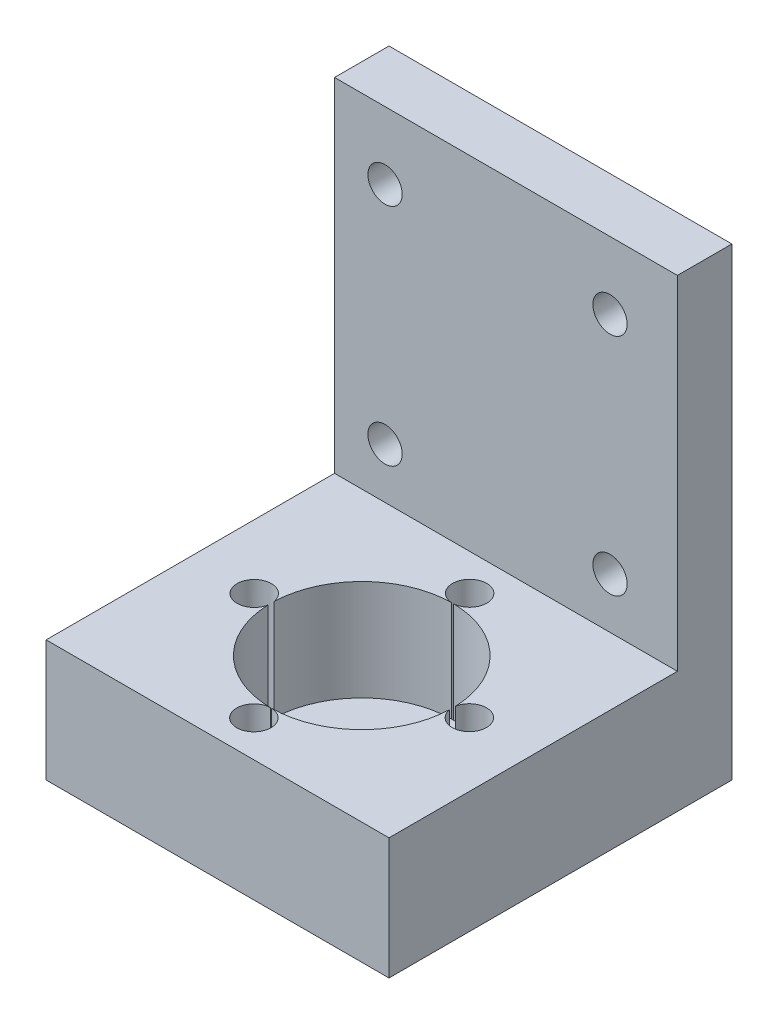
ISO-10303-21;
HEADER;
FILE_DESCRIPTION(('STEP AP214'),'2;1');
FILE_NAME('part.step','',(''),(''),'','','');
FILE_SCHEMA(('AUTOMOTIVE_DESIGN { 1 0 10303 214 1 1 1 1 }'));
ENDSEC;
DATA;
#1=APPLICATION_CONTEXT('core data for automotive mechanical design processes');
#2=APPLICATION_PROTOCOL_DEFINITION('international standard','automotive_design',2000,#1);
#3=PRODUCT_CONTEXT('',#1,'mechanical');
#4=PRODUCT('Part','Part','',(#3));
#5=PRODUCT_RELATED_PRODUCT_CATEGORY('part','',(#4));
#6=PRODUCT_DEFINITION_FORMATION('','',#4);
#7=PRODUCT_DEFINITION_CONTEXT('part definition',#1,'design');
#8=PRODUCT_DEFINITION('design','',#6,#7);
#9=PRODUCT_DEFINITION_SHAPE('','',#8);
#10=(LENGTH_UNIT() NAMED_UNIT(*) SI_UNIT(.MILLI.,.METRE.));
#11=(NAMED_UNIT(*) PLANE_ANGLE_UNIT() SI_UNIT($,.RADIAN.));
#12=(NAMED_UNIT(*) SI_UNIT($,.STERADIAN.) SOLID_ANGLE_UNIT());
#13=UNCERTAINTY_MEASURE_WITH_UNIT(LENGTH_MEASURE(1.E-05),#10,'distance_accuracy_value','');
#14=(GEOMETRIC_REPRESENTATION_CONTEXT(3) GLOBAL_UNCERTAINTY_ASSIGNED_CONTEXT((#13)) GLOBAL_UNIT_ASSIGNED_CONTEXT((#10,
#11,#12)) REPRESENTATION_CONTEXT('',''));
#15=CARTESIAN_POINT('',(0.,0.,0.));
#16=DIRECTION('',(0.,0.,1.));
#17=DIRECTION('',(1.,0.,0.));
#18=AXIS2_PLACEMENT_3D('',#15,#16,#17);
#19=CARTESIAN_POINT('',(0.,12.04,0.));
#20=DIRECTION('',(0.,-1.,0.));
#21=DIRECTION('',(0.,0.,-1.));
#22=AXIS2_PLACEMENT_3D('',#19,#20,#21);
#23=PLANE('',#22);
#24=DIRECTION('',(1.,0.,0.));
#25=VECTOR('',#24,1.);
#26=CARTESIAN_POINT('',(0.,12.04,-28.6));
#27=LINE('',#26,#25);
#28=CARTESIAN_POINT('',(0.,12.04,-28.6));
#29=VERTEX_POINT('',#28);
#30=CARTESIAN_POINT('',(34.,12.04,-28.6));
#31=VERTEX_POINT('',#30);
#32=EDGE_CURVE('E1816',#29,#31,#27,.T.);
#33=ORIENTED_EDGE('',*,*,#32,.F.);
#34=DIRECTION('',(0.,0.,1.));
#35=VECTOR('',#34,1.);
#36=CARTESIAN_POINT('',(0.,12.04,0.));
#37=LINE('',#36,#35);
#38=CARTESIAN_POINT('',(0.,12.04,0.));
#39=VERTEX_POINT('',#38);
#40=EDGE_CURVE('E1863',#29,#39,#37,.T.);
#41=ORIENTED_EDGE('',*,*,#40,.T.);
#42=DIRECTION('',(1.,0.,0.));
#43=VECTOR('',#42,1.);
#44=CARTESIAN_POINT('',(0.,12.04,0.));
#45=LINE('',#44,#43);
#46=CARTESIAN_POINT('',(34.,12.04,0.));
#47=VERTEX_POINT('',#46);
#48=EDGE_CURVE('E1879',#39,#47,#45,.T.);
#49=ORIENTED_EDGE('',*,*,#48,.T.);
#50=DIRECTION('',(0.,0.,-1.));
#51=VECTOR('',#50,1.);
#52=CARTESIAN_POINT('',(34.,12.04,0.));
#53=LINE('',#52,#51);
#54=EDGE_CURVE('E1857',#47,#31,#53,.T.);
#55=ORIENTED_EDGE('',*,*,#54,.T.);
#56=EDGE_LOOP('',(#33,#41,#49,#55));
#57=FACE_BOUND('',#56,.T.);
#58=CARTESIAN_POINT('',(17.,12.04,-3.60086466627301));
#59=DIRECTION('',(0.,1.,0.));
#60=DIRECTION('',(0.,0.,1.));
#61=AXIS2_PLACEMENT_3D('',#58,#59,#60);
#62=CIRCLE('',#61,1.7);
#63=CARTESIAN_POINT('',(16.9502774097286,12.04,-5.30013735304717));
#64=VERTEX_POINT('',#63);
#65=CARTESIAN_POINT('',(17.0497225902714,12.04,-5.30013735304717));
#66=VERTEX_POINT('',#65);
#67=EDGE_CURVE('E1739',#64,#66,#62,.T.);
#68=ORIENTED_EDGE('',*,*,#67,.F.);
#69=CARTESIAN_POINT('',(17.,12.04,-14.3));
#70=DIRECTION('',(0.,1.,0.));
#71=DIRECTION('',(0.,0.,1.));
#72=AXIS2_PLACEMENT_3D('',#69,#70,#71);
#73=CIRCLE('',#72,9.);
#74=CARTESIAN_POINT('',(8.0053002863898,12.04,-13.9911682302926));
#75=VERTEX_POINT('',#74);
#76=EDGE_CURVE('E1733',#75,#64,#73,.T.);
#77=ORIENTED_EDGE('',*,*,#76,.F.);
#78=CARTESIAN_POINT('',(6.33358771001208,12.04,-14.3));
#79=DIRECTION('',(0.,1.,0.));
#80=DIRECTION('',(0.,0.,1.));
#81=AXIS2_PLACEMENT_3D('',#78,#79,#80);
#82=CIRCLE('',#81,1.7);
#83=CARTESIAN_POINT('',(8.0053002863898,12.04,-14.6088317697074));
#84=VERTEX_POINT('',#83);
#85=EDGE_CURVE('E1994',#84,#75,#82,.T.);
#86=ORIENTED_EDGE('',*,*,#85,.F.);
#87=CARTESIAN_POINT('',(16.9142641182388,12.04,-23.299591621767));
#88=VERTEX_POINT('',#87);
#89=EDGE_CURVE('E1718',#88,#84,#73,.T.);
#90=ORIENTED_EDGE('',*,*,#89,.F.);
#91=CARTESIAN_POINT('',(17.,12.04,-24.9974282919384));
#92=DIRECTION('',(0.,1.,0.));
#93=DIRECTION('',(0.,0.,1.));
#94=AXIS2_PLACEMENT_3D('',#91,#92,#93);
#95=CIRCLE('',#94,1.7);
#96=CARTESIAN_POINT('',(17.0857358817612,12.04,-23.299591621767));
#97=VERTEX_POINT('',#96);
#98=EDGE_CURVE('E1698',#97,#88,#95,.T.);
#99=ORIENTED_EDGE('',*,*,#98,.F.);
#100=CARTESIAN_POINT('',(25.9950848581649,12.04,-14.5974027478235));
#101=VERTEX_POINT('',#100);
#102=EDGE_CURVE('E1715',#101,#97,#73,.T.);
#103=ORIENTED_EDGE('',*,*,#102,.F.);
#104=CARTESIAN_POINT('',(27.6688685073224,12.04,-14.3));
#105=DIRECTION('',(0.,1.,0.));
#106=DIRECTION('',(0.,0.,1.));
#107=AXIS2_PLACEMENT_3D('',#104,#105,#106);
#108=CIRCLE('',#107,1.700000029);
#109=CARTESIAN_POINT('',(25.9950848581649,12.04,-14.0025972521765));
#110=VERTEX_POINT('',#109);
#111=EDGE_CURVE('E1981',#110,#101,#108,.T.);
#112=ORIENTED_EDGE('',*,*,#111,.F.);
#113=EDGE_CURVE('E1600',#66,#110,#73,.T.);
#114=ORIENTED_EDGE('',*,*,#113,.F.);
#115=EDGE_LOOP('',(#68,#77,#86,#90,#99,#103,#112,#114));
#116=FACE_BOUND('',#115,.T.);
#117=ADVANCED_FACE('F1592',(#57,#116),#23,.F.);
#118=CARTESIAN_POINT('',(17.,2.04,-14.3));
#119=DIRECTION('',(0.,1.,0.));
#120=DIRECTION('',(0.,0.,1.));
#121=AXIS2_PLACEMENT_3D('',#118,#119,#120);
#122=CYLINDRICAL_SURFACE('',#121,9.);
#123=CARTESIAN_POINT('',(17.,2.04,-14.3));
#124=DIRECTION('',(0.,1.,0.));
#125=DIRECTION('',(0.,0.,1.));
#126=AXIS2_PLACEMENT_3D('',#123,#124,#125);
#127=CIRCLE('',#126,9.);
#128=CARTESIAN_POINT('',(17.0497225902711,2.04,-5.30013735304717));
#129=VERTEX_POINT('',#128);
#130=CARTESIAN_POINT('',(25.9950848581649,2.04,-14.0025972521765));
#131=VERTEX_POINT('',#130);
#132=EDGE_CURVE('E1811',#129,#131,#127,.T.);
#133=ORIENTED_EDGE('',*,*,#132,.F.);
#134=DIRECTION('',(0.,1.,0.));
#135=VECTOR('',#134,1.);
#136=CARTESIAN_POINT('',(17.0497225902711,6.02,-5.30013735304718));
#137=LINE('',#136,#135);
#138=EDGE_CURVE('E1748',#129,#66,#137,.T.);
#139=ORIENTED_EDGE('',*,*,#138,.T.);
#140=ORIENTED_EDGE('',*,*,#113,.T.);
#141=DIRECTION('',(0.,1.,0.));
#142=VECTOR('',#141,1.);
#143=CARTESIAN_POINT('',(25.9950848581649,6.02,-14.0025972521765));
#144=LINE('',#143,#142);
#145=EDGE_CURVE('E1975',#110,#131,#144,.F.);
#146=ORIENTED_EDGE('',*,*,#145,.T.);
#147=EDGE_LOOP('',(#133,#139,#140,#146));
#148=FACE_BOUND('',#147,.T.);
#149=ADVANCED_FACE('F1931',(#148),#122,.F.);
#150=CARTESIAN_POINT('',(25.9950848581649,2.04,-14.5974027478235));
#151=VERTEX_POINT('',#150);
#152=CARTESIAN_POINT('',(17.0857358817611,2.04,-23.299591621767));
#153=VERTEX_POINT('',#152);
#154=EDGE_CURVE('E1818',#151,#153,#127,.T.);
#155=ORIENTED_EDGE('',*,*,#154,.F.);
#156=DIRECTION('',(0.,1.,0.));
#157=VECTOR('',#156,1.);
#158=CARTESIAN_POINT('',(25.9950848581649,6.02,-14.5974027478235));
#159=LINE('',#158,#157);
#160=EDGE_CURVE('E1721',#151,#101,#159,.T.);
#161=ORIENTED_EDGE('',*,*,#160,.T.);
#162=ORIENTED_EDGE('',*,*,#102,.T.);
#163=DIRECTION('',(0.,1.,0.));
#164=VECTOR('',#163,1.);
#165=CARTESIAN_POINT('',(17.0857358817611,6.02,-23.299591621767));
#166=LINE('',#165,#164);
#167=EDGE_CURVE('E1694',#97,#153,#166,.F.);
#168=ORIENTED_EDGE('',*,*,#167,.T.);
#169=EDGE_LOOP('',(#155,#161,#162,#168));
#170=FACE_BOUND('',#169,.T.);
#171=ADVANCED_FACE('F1725',(#170),#122,.F.);
#172=ORIENTED_EDGE('',*,*,#76,.T.);
#173=DIRECTION('',(0.,1.,0.));
#174=VECTOR('',#173,1.);
#175=CARTESIAN_POINT('',(16.9502774097289,6.02,-5.30013735304718));
#176=LINE('',#175,#174);
#177=CARTESIAN_POINT('',(16.9502774097289,2.04,-5.30013735304717));
#178=VERTEX_POINT('',#177);
#179=EDGE_CURVE('E1756',#64,#178,#176,.F.);
#180=ORIENTED_EDGE('',*,*,#179,.T.);
#181=CARTESIAN_POINT('',(8.0053002863898,2.04,-13.9911682302927));
#182=VERTEX_POINT('',#181);
#183=EDGE_CURVE('E1728',#182,#178,#127,.T.);
#184=ORIENTED_EDGE('',*,*,#183,.F.);
#185=DIRECTION('',(0.,1.,0.));
#186=VECTOR('',#185,1.);
#187=CARTESIAN_POINT('',(8.0053002863898,6.02,-13.9911682302927));
#188=LINE('',#187,#186);
#189=EDGE_CURVE('E1612',#182,#75,#188,.T.);
#190=ORIENTED_EDGE('',*,*,#189,.T.);
#191=EDGE_LOOP('',(#172,#180,#184,#190));
#192=FACE_BOUND('',#191,.T.);
#193=ADVANCED_FACE('F1952',(#192),#122,.F.);
#194=CARTESIAN_POINT('',(0.,12.04,0.));
#195=DIRECTION('',(1.,0.,0.));
#196=DIRECTION('',(0.,0.,-1.));
#197=AXIS2_PLACEMENT_3D('',#194,#195,#196);
#198=PLANE('',#197);
#199=DIRECTION('',(0.,0.,1.));
#200=VECTOR('',#199,1.);
#201=CARTESIAN_POINT('',(0.,0.,0.));
#202=LINE('',#201,#200);
#203=CARTESIAN_POINT('',(0.,0.,-34.));
#204=VERTEX_POINT('',#203);
#205=CARTESIAN_POINT('',(0.,0.,0.));
#206=VERTEX_POINT('',#205);
#207=EDGE_CURVE('E1869',#204,#206,#202,.T.);
#208=ORIENTED_EDGE('',*,*,#207,.T.);
#209=DIRECTION('',(0.,-1.,0.));
#210=VECTOR('',#209,1.);
#211=CARTESIAN_POINT('',(0.,12.04,0.));
#212=LINE('',#211,#210);
#213=EDGE_CURVE('E1842',#39,#206,#212,.T.);
#214=ORIENTED_EDGE('',*,*,#213,.F.);
#215=ORIENTED_EDGE('',*,*,#40,.F.);
#216=DIRECTION('',(0.,-1.,0.));
#217=VECTOR('',#216,1.);
#218=CARTESIAN_POINT('',(0.,46.04,-28.6));
#219=LINE('',#218,#217);
#220=CARTESIAN_POINT('',(0.,46.04,-28.6));
#221=VERTEX_POINT('',#220);
#222=EDGE_CURVE('E1871',#221,#29,#219,.T.);
#223=ORIENTED_EDGE('',*,*,#222,.F.);
#224=DIRECTION('',(0.,0.,1.));
#225=VECTOR('',#224,1.);
#226=CARTESIAN_POINT('',(0.,46.04,-34.));
#227=LINE('',#226,#225);
#228=CARTESIAN_POINT('',(0.,46.04,-34.));
#229=VERTEX_POINT('',#228);
#230=EDGE_CURVE('E1895',#229,#221,#227,.T.);
#231=ORIENTED_EDGE('',*,*,#230,.F.);
#232=DIRECTION('',(0.,-1.,0.));
#233=VECTOR('',#232,1.);
#234=CARTESIAN_POINT('',(0.,12.04,-34.));
#235=LINE('',#234,#233);
#236=EDGE_CURVE('E1852',#229,#204,#235,.T.);
#237=ORIENTED_EDGE('',*,*,#236,.T.);
#238=EDGE_LOOP('',(#208,#214,#215,#223,#231,#237));
#239=FACE_BOUND('',#238,.T.);
#240=ADVANCED_FACE('F1594',(#239),#198,.F.);
#241=CARTESIAN_POINT('',(0.,12.04,0.));
#242=DIRECTION('',(0.,0.,-1.));
#243=DIRECTION('',(-1.,0.,0.));
#244=AXIS2_PLACEMENT_3D('',#241,#242,#243);
#245=PLANE('',#244);
#246=DIRECTION('',(1.,0.,0.));
#247=VECTOR('',#246,1.);
#248=CARTESIAN_POINT('',(0.,0.,0.));
#249=LINE('',#248,#247);
#250=CARTESIAN_POINT('',(34.,0.,0.));
#251=VERTEX_POINT('',#250);
#252=EDGE_CURVE('E1870',#206,#251,#249,.T.);
#253=ORIENTED_EDGE('',*,*,#252,.T.);
#254=DIRECTION('',(0.,-1.,0.));
#255=VECTOR('',#254,1.);
#256=CARTESIAN_POINT('',(34.,12.04,0.));
#257=LINE('',#256,#255);
#258=EDGE_CURVE('E1847',#47,#251,#257,.T.);
#259=ORIENTED_EDGE('',*,*,#258,.F.);
#260=ORIENTED_EDGE('',*,*,#48,.F.);
#261=ORIENTED_EDGE('',*,*,#213,.T.);
#262=EDGE_LOOP('',(#253,#259,#260,#261));
#263=FACE_BOUND('',#262,.T.);
#264=ADVANCED_FACE('F1932',(#263),#245,.F.);
#265=CARTESIAN_POINT('',(34.,12.04,0.));
#266=DIRECTION('',(-1.,0.,0.));
#267=DIRECTION('',(0.,0.,1.));
#268=AXIS2_PLACEMENT_3D('',#265,#266,#267);
#269=PLANE('',#268);
#270=DIRECTION('',(0.,0.,-1.));
#271=VECTOR('',#270,1.);
#272=CARTESIAN_POINT('',(34.,0.,0.));
#273=LINE('',#272,#271);
#274=CARTESIAN_POINT('',(34.,0.,-34.));
#275=VERTEX_POINT('',#274);
#276=EDGE_CURVE('E1862',#251,#275,#273,.T.);
#277=ORIENTED_EDGE('',*,*,#276,.T.);
#278=DIRECTION('',(0.,-1.,0.));
#279=VECTOR('',#278,1.);
#280=CARTESIAN_POINT('',(34.,12.04,-34.));
#281=LINE('',#280,#279);
#282=CARTESIAN_POINT('',(34.,46.04,-34.));
#283=VERTEX_POINT('',#282);
#284=EDGE_CURVE('E1853',#283,#275,#281,.T.);
#285=ORIENTED_EDGE('',*,*,#284,.F.);
#286=DIRECTION('',(0.,0.,-1.));
#287=VECTOR('',#286,1.);
#288=CARTESIAN_POINT('',(34.,46.04,-34.));
#289=LINE('',#288,#287);
#290=CARTESIAN_POINT('',(34.,46.04,-28.6));
#291=VERTEX_POINT('',#290);
#292=EDGE_CURVE('E1899',#291,#283,#289,.T.);
#293=ORIENTED_EDGE('',*,*,#292,.F.);
#294=DIRECTION('',(0.,-1.,0.));
#295=VECTOR('',#294,1.);
#296=CARTESIAN_POINT('',(34.,46.04,-28.6));
#297=LINE('',#296,#295);
#298=EDGE_CURVE('E1881',#291,#31,#297,.T.);
#299=ORIENTED_EDGE('',*,*,#298,.T.);
#300=ORIENTED_EDGE('',*,*,#54,.F.);
#301=ORIENTED_EDGE('',*,*,#258,.T.);
#302=EDGE_LOOP('',(#277,#285,#293,#299,#300,#301));
#303=FACE_BOUND('',#302,.T.);
#304=ADVANCED_FACE('F1919',(#303),#269,.F.);
#305=CARTESIAN_POINT('',(0.,12.04,-34.));
#306=DIRECTION('',(0.,0.,1.));
#307=DIRECTION('',(1.,0.,0.));
#308=AXIS2_PLACEMENT_3D('',#305,#306,#307);
#309=PLANE('',#308);
#310=CARTESIAN_POINT('',(27.3170867062394,17.0466827237252,-34.));
#311=DIRECTION('',(0.,0.,1.));
#312=DIRECTION('',(1.,0.,0.));
#313=AXIS2_PLACEMENT_3D('',#310,#311,#312);
#314=CIRCLE('',#313,1.7);
#315=CARTESIAN_POINT('',(29.0170867062394,17.0466827237252,-34.));
#316=VERTEX_POINT('',#315);
#317=EDGE_CURVE('E2080',#316,#316,#314,.T.);
#318=ORIENTED_EDGE('',*,*,#317,.T.);
#319=EDGE_LOOP('',(#318));
#320=FACE_BOUND('',#319,.T.);
#321=CARTESIAN_POINT('',(27.3170867062394,39.3570867062394,-34.));
#322=DIRECTION('',(0.,0.,1.));
#323=DIRECTION('',(1.,0.,0.));
#324=AXIS2_PLACEMENT_3D('',#321,#322,#323);
#325=CIRCLE('',#324,1.7);
#326=CARTESIAN_POINT('',(29.0170867062394,39.3570867062394,-34.));
#327=VERTEX_POINT('',#326);
#328=EDGE_CURVE('E2070',#327,#327,#325,.T.);
#329=ORIENTED_EDGE('',*,*,#328,.T.);
#330=EDGE_LOOP('',(#329));
#331=FACE_BOUND('',#330,.T.);
#332=CARTESIAN_POINT('',(5.00668272372523,39.3570867062394,-34.));
#333=DIRECTION('',(0.,0.,1.));
#334=DIRECTION('',(1.,0.,0.));
#335=AXIS2_PLACEMENT_3D('',#332,#333,#334);
#336=CIRCLE('',#335,1.7);
#337=CARTESIAN_POINT('',(6.70668272372523,39.3570867062394,-34.));
#338=VERTEX_POINT('',#337);
#339=EDGE_CURVE('E2050',#338,#338,#336,.T.);
#340=ORIENTED_EDGE('',*,*,#339,.T.);
#341=EDGE_LOOP('',(#340));
#342=FACE_BOUND('',#341,.T.);
#343=CARTESIAN_POINT('',(5.00668272372523,17.0466827237252,-34.));
#344=DIRECTION('',(0.,0.,1.));
#345=DIRECTION('',(1.,0.,0.));
#346=AXIS2_PLACEMENT_3D('',#343,#344,#345);
#347=CIRCLE('',#346,1.7);
#348=CARTESIAN_POINT('',(6.70668272372523,17.0466827237252,-34.));
#349=VERTEX_POINT('',#348);
#350=EDGE_CURVE('E2063',#349,#349,#347,.T.);
#351=ORIENTED_EDGE('',*,*,#350,.T.);
#352=EDGE_LOOP('',(#351));
#353=FACE_BOUND('',#352,.T.);
#354=DIRECTION('',(-1.,0.,0.));
#355=VECTOR('',#354,1.);
#356=CARTESIAN_POINT('',(0.,0.,-34.));
#357=LINE('',#356,#355);
#358=EDGE_CURVE('E1859',#275,#204,#357,.T.);
#359=ORIENTED_EDGE('',*,*,#358,.T.);
#360=ORIENTED_EDGE('',*,*,#236,.F.);
#361=DIRECTION('',(-1.,0.,0.));
#362=VECTOR('',#361,1.);
#363=CARTESIAN_POINT('',(0.,46.04,-34.));
#364=LINE('',#363,#362);
#365=EDGE_CURVE('E1889',#283,#229,#364,.T.);
#366=ORIENTED_EDGE('',*,*,#365,.F.);
#367=ORIENTED_EDGE('',*,*,#284,.T.);
#368=EDGE_LOOP('',(#359,#360,#366,#367));
#369=FACE_BOUND('',#368,.T.);
#370=ADVANCED_FACE('F1925',(#320,#331,#342,#353,#369),#309,.F.);
#371=CARTESIAN_POINT('',(0.,0.,0.));
#372=DIRECTION('',(0.,-1.,0.));
#373=DIRECTION('',(0.,0.,-1.));
#374=AXIS2_PLACEMENT_3D('',#371,#372,#373);
#375=PLANE('',#374);
#376=CARTESIAN_POINT('',(17.,0.,-14.3));
#377=DIRECTION('',(0.,1.,0.));
#378=DIRECTION('',(0.,0.,1.));
#379=AXIS2_PLACEMENT_3D('',#376,#377,#378);
#380=CIRCLE('',#379,3.);
#381=CARTESIAN_POINT('',(17.,0.,-11.3));
#382=VERTEX_POINT('',#381);
#383=EDGE_CURVE('E2001',#382,#382,#380,.T.);
#384=ORIENTED_EDGE('',*,*,#383,.T.);
#385=EDGE_LOOP('',(#384));
#386=FACE_BOUND('',#385,.T.);
#387=CARTESIAN_POINT('',(17.,0.,-3.60086466627301));
#388=DIRECTION('',(0.,1.,0.));
#389=DIRECTION('',(0.,0.,1.));
#390=AXIS2_PLACEMENT_3D('',#387,#388,#389);
#391=CIRCLE('',#390,1.7);
#392=CARTESIAN_POINT('',(17.,0.,-1.90086466627301));
#393=VERTEX_POINT('',#392);
#394=EDGE_CURVE('E1707',#393,#393,#391,.T.);
#395=ORIENTED_EDGE('',*,*,#394,.T.);
#396=EDGE_LOOP('',(#395));
#397=FACE_BOUND('',#396,.T.);
#398=CARTESIAN_POINT('',(27.6688685073224,0.,-14.3));
#399=DIRECTION('',(0.,1.,0.));
#400=DIRECTION('',(0.,0.,1.));
#401=AXIS2_PLACEMENT_3D('',#398,#399,#400);
#402=CIRCLE('',#401,1.700000029);
#403=CARTESIAN_POINT('',(27.6688685073224,0.,-12.599999971));
#404=VERTEX_POINT('',#403);
#405=EDGE_CURVE('E1987',#404,#404,#402,.T.);
#406=ORIENTED_EDGE('',*,*,#405,.T.);
#407=EDGE_LOOP('',(#406));
#408=FACE_BOUND('',#407,.T.);
#409=CARTESIAN_POINT('',(6.33358771001208,0.,-14.3));
#410=DIRECTION('',(0.,1.,0.));
#411=DIRECTION('',(0.,0.,1.));
#412=AXIS2_PLACEMENT_3D('',#409,#410,#411);
#413=CIRCLE('',#412,1.7);
#414=CARTESIAN_POINT('',(6.33358771001208,0.,-12.6));
#415=VERTEX_POINT('',#414);
#416=EDGE_CURVE('E1717',#415,#415,#413,.T.);
#417=ORIENTED_EDGE('',*,*,#416,.T.);
#418=EDGE_LOOP('',(#417));
#419=FACE_BOUND('',#418,.T.);
#420=CARTESIAN_POINT('',(17.,0.,-24.9974282919384));
#421=DIRECTION('',(0.,1.,0.));
#422=DIRECTION('',(0.,0.,1.));
#423=AXIS2_PLACEMENT_3D('',#420,#421,#422);
#424=CIRCLE('',#423,1.7);
#425=CARTESIAN_POINT('',(17.,0.,-23.2974282919384));
#426=VERTEX_POINT('',#425);
#427=EDGE_CURVE('E1720',#426,#426,#424,.T.);
#428=ORIENTED_EDGE('',*,*,#427,.T.);
#429=EDGE_LOOP('',(#428));
#430=FACE_BOUND('',#429,.T.);
#431=ORIENTED_EDGE('',*,*,#207,.F.);
#432=ORIENTED_EDGE('',*,*,#358,.F.);
#433=ORIENTED_EDGE('',*,*,#276,.F.);
#434=ORIENTED_EDGE('',*,*,#252,.F.);
#435=EDGE_LOOP('',(#431,#432,#433,#434));
#436=FACE_BOUND('',#435,.T.);
#437=ADVANCED_FACE('F1927',(#386,#397,#408,#419,#430,#436),#375,.T.);
#438=CARTESIAN_POINT('',(0.,46.04,-28.6));
#439=DIRECTION('',(0.,0.,-1.));
#440=DIRECTION('',(-1.,0.,0.));
#441=AXIS2_PLACEMENT_3D('',#438,#439,#440);
#442=PLANE('',#441);
#443=CARTESIAN_POINT('',(27.3170867062394,17.0466827237252,-28.6));
#444=DIRECTION('',(0.,0.,1.));
#445=DIRECTION('',(1.,0.,0.));
#446=AXIS2_PLACEMENT_3D('',#443,#444,#445);
#447=CIRCLE('',#446,1.7);
#448=CARTESIAN_POINT('',(29.0170867062394,17.0466827237252,-28.6));
#449=VERTEX_POINT('',#448);
#450=EDGE_CURVE('E2071',#449,#449,#447,.T.);
#451=ORIENTED_EDGE('',*,*,#450,.F.);
#452=EDGE_LOOP('',(#451));
#453=FACE_BOUND('',#452,.T.);
#454=CARTESIAN_POINT('',(27.3170867062394,39.3570867062394,-28.6));
#455=DIRECTION('',(0.,0.,1.));
#456=DIRECTION('',(1.,0.,0.));
#457=AXIS2_PLACEMENT_3D('',#454,#455,#456);
#458=CIRCLE('',#457,1.7);
#459=CARTESIAN_POINT('',(29.0170867062394,39.3570867062394,-28.6));
#460=VERTEX_POINT('',#459);
#461=EDGE_CURVE('E2062',#460,#460,#458,.T.);
#462=ORIENTED_EDGE('',*,*,#461,.F.);
#463=EDGE_LOOP('',(#462));
#464=FACE_BOUND('',#463,.T.);
#465=CARTESIAN_POINT('',(5.00668272372523,39.3570867062394,-28.6));
#466=DIRECTION('',(0.,0.,1.));
#467=DIRECTION('',(1.,0.,0.));
#468=AXIS2_PLACEMENT_3D('',#465,#466,#467);
#469=CIRCLE('',#468,1.7);
#470=CARTESIAN_POINT('',(6.70668272372523,39.3570867062394,-28.6));
#471=VERTEX_POINT('',#470);
#472=EDGE_CURVE('E2055',#471,#471,#469,.T.);
#473=ORIENTED_EDGE('',*,*,#472,.F.);
#474=EDGE_LOOP('',(#473));
#475=FACE_BOUND('',#474,.T.);
#476=CARTESIAN_POINT('',(5.00668272372523,17.0466827237252,-28.6));
#477=DIRECTION('',(0.,0.,1.));
#478=DIRECTION('',(1.,0.,0.));
#479=AXIS2_PLACEMENT_3D('',#476,#477,#478);
#480=CIRCLE('',#479,1.7);
#481=CARTESIAN_POINT('',(6.70668272372523,17.0466827237252,-28.6));
#482=VERTEX_POINT('',#481);
#483=EDGE_CURVE('E2053',#482,#482,#480,.T.);
#484=ORIENTED_EDGE('',*,*,#483,.F.);
#485=EDGE_LOOP('',(#484));
#486=FACE_BOUND('',#485,.T.);
#487=ORIENTED_EDGE('',*,*,#32,.T.);
#488=ORIENTED_EDGE('',*,*,#298,.F.);
#489=DIRECTION('',(1.,0.,0.));
#490=VECTOR('',#489,1.);
#491=CARTESIAN_POINT('',(0.,46.04,-28.6));
#492=LINE('',#491,#490);
#493=EDGE_CURVE('E1903',#221,#291,#492,.T.);
#494=ORIENTED_EDGE('',*,*,#493,.F.);
#495=ORIENTED_EDGE('',*,*,#222,.T.);
#496=EDGE_LOOP('',(#487,#488,#494,#495));
#497=FACE_BOUND('',#496,.T.);
#498=ADVANCED_FACE('F1916',(#453,#464,#475,#486,#497),#442,.F.);
#499=CARTESIAN_POINT('',(0.,46.04,0.));
#500=DIRECTION('',(0.,1.,0.));
#501=DIRECTION('',(0.,0.,1.));
#502=AXIS2_PLACEMENT_3D('',#499,#500,#501);
#503=PLANE('',#502);
#504=ORIENTED_EDGE('',*,*,#230,.T.);
#505=ORIENTED_EDGE('',*,*,#493,.T.);
#506=ORIENTED_EDGE('',*,*,#292,.T.);
#507=ORIENTED_EDGE('',*,*,#365,.T.);
#508=EDGE_LOOP('',(#504,#505,#506,#507));
#509=FACE_BOUND('',#508,.T.);
#510=ADVANCED_FACE('F1909',(#509),#503,.T.);
#511=ORIENTED_EDGE('',*,*,#89,.T.);
#512=DIRECTION('',(0.,1.,0.));
#513=VECTOR('',#512,1.);
#514=CARTESIAN_POINT('',(8.0053002863898,6.02,-14.6088317697073));
#515=LINE('',#514,#513);
#516=CARTESIAN_POINT('',(8.0053002863898,2.04,-14.6088317697073));
#517=VERTEX_POINT('',#516);
#518=EDGE_CURVE('E1962',#84,#517,#515,.F.);
#519=ORIENTED_EDGE('',*,*,#518,.T.);
#520=CARTESIAN_POINT('',(16.9142641182389,2.04,-23.299591621767));
#521=VERTEX_POINT('',#520);
#522=EDGE_CURVE('E1825',#521,#517,#127,.T.);
#523=ORIENTED_EDGE('',*,*,#522,.F.);
#524=DIRECTION('',(0.,1.,0.));
#525=VECTOR('',#524,1.);
#526=CARTESIAN_POINT('',(16.9142641182389,6.02,-23.299591621767));
#527=LINE('',#526,#525);
#528=EDGE_CURVE('E1616',#521,#88,#527,.T.);
#529=ORIENTED_EDGE('',*,*,#528,.T.);
#530=EDGE_LOOP('',(#511,#519,#523,#529));
#531=FACE_BOUND('',#530,.T.);
#532=ADVANCED_FACE('F1798',(#531),#122,.F.);
#533=CARTESIAN_POINT('',(17.,2.04,-14.3));
#534=DIRECTION('',(0.,1.,0.));
#535=DIRECTION('',(0.,0.,1.));
#536=AXIS2_PLACEMENT_3D('',#533,#534,#535);
#537=PLANE('',#536);
#538=CARTESIAN_POINT('',(17.,2.04,-14.3));
#539=DIRECTION('',(0.,1.,0.));
#540=DIRECTION('',(0.,0.,1.));
#541=AXIS2_PLACEMENT_3D('',#538,#539,#540);
#542=CIRCLE('',#541,3.);
#543=CARTESIAN_POINT('',(17.,2.04,-11.3));
#544=VERTEX_POINT('',#543);
#545=EDGE_CURVE('E2083',#544,#544,#542,.T.);
#546=ORIENTED_EDGE('',*,*,#545,.F.);
#547=EDGE_LOOP('',(#546));
#548=FACE_BOUND('',#547,.T.);
#549=CARTESIAN_POINT('',(16.9502774097289,2.04,-5.30013735304718));
#550=CARTESIAN_POINT('',(17.,2.04,-5.30159229079938));
#551=CARTESIAN_POINT('',(17.0497225902711,2.04,-5.30013735304718));
#552=B_SPLINE_CURVE_WITH_KNOTS('',2,(#549,#550,#551),.UNSPECIFIED.,.F.,.F.,(3,3),(0.,1.),.UNSPECIFIED.);
#553=EDGE_CURVE('E12',#178,#129,#552,.T.);
#554=ORIENTED_EDGE('',*,*,#553,.T.);
#555=ORIENTED_EDGE('',*,*,#132,.T.);
#556=CARTESIAN_POINT('',(27.6688685073224,2.04,-14.3));
#557=DIRECTION('',(0.,1.,0.));
#558=DIRECTION('',(0.,0.,1.));
#559=AXIS2_PLACEMENT_3D('',#556,#557,#558);
#560=CIRCLE('',#559,1.700000029);
#561=EDGE_CURVE('E1601',#151,#131,#560,.T.);
#562=ORIENTED_EDGE('',*,*,#561,.F.);
#563=ORIENTED_EDGE('',*,*,#154,.T.);
#564=CARTESIAN_POINT('',(17.0857358817611,2.04,-23.299591621767));
#565=CARTESIAN_POINT('',(17.,2.04,-23.2952622056633));
#566=CARTESIAN_POINT('',(16.9142641182389,2.04,-23.299591621767));
#567=B_SPLINE_CURVE_WITH_KNOTS('',2,(#564,#565,#566),.UNSPECIFIED.,.F.,.F.,(3,3),(0.,1.),.UNSPECIFIED.);
#568=EDGE_CURVE('E1697',#153,#521,#567,.T.);
#569=ORIENTED_EDGE('',*,*,#568,.T.);
#570=ORIENTED_EDGE('',*,*,#522,.T.);
#571=CARTESIAN_POINT('',(6.33358771001208,2.04,-14.3));
#572=DIRECTION('',(0.,1.,0.));
#573=DIRECTION('',(0.,0.,1.));
#574=AXIS2_PLACEMENT_3D('',#571,#572,#573);
#575=CIRCLE('',#574,1.7);
#576=EDGE_CURVE('E1839',#182,#517,#575,.T.);
#577=ORIENTED_EDGE('',*,*,#576,.F.);
#578=ORIENTED_EDGE('',*,*,#183,.T.);
#579=EDGE_LOOP('',(#554,#555,#562,#563,#569,#570,#577,#578));
#580=FACE_BOUND('',#579,.T.);
#581=ADVANCED_FACE('F1786',(#548,#580),#537,.T.);
#582=CARTESIAN_POINT('',(17.,0.,-24.9974282919384));
#583=DIRECTION('',(0.,1.,0.));
#584=DIRECTION('',(0.,0.,1.));
#585=AXIS2_PLACEMENT_3D('',#582,#583,#584);
#586=CYLINDRICAL_SURFACE('',#585,1.7);
#587=ORIENTED_EDGE('',*,*,#427,.F.);
#588=EDGE_LOOP('',(#587));
#589=FACE_BOUND('',#588,.T.);
#590=ORIENTED_EDGE('',*,*,#568,.F.);
#591=ORIENTED_EDGE('',*,*,#167,.F.);
#592=ORIENTED_EDGE('',*,*,#98,.T.);
#593=ORIENTED_EDGE('',*,*,#528,.F.);
#594=EDGE_LOOP('',(#590,#591,#592,#593));
#595=FACE_BOUND('',#594,.T.);
#596=ADVANCED_FACE('F1700',(#589,#595),#586,.F.);
#597=CARTESIAN_POINT('',(6.33358771001208,0.,-14.3));
#598=DIRECTION('',(0.,1.,0.));
#599=DIRECTION('',(0.,0.,1.));
#600=AXIS2_PLACEMENT_3D('',#597,#598,#599);
#601=CYLINDRICAL_SURFACE('',#600,1.7);
#602=ORIENTED_EDGE('',*,*,#416,.F.);
#603=EDGE_LOOP('',(#602));
#604=FACE_BOUND('',#603,.T.);
#605=ORIENTED_EDGE('',*,*,#576,.T.);
#606=ORIENTED_EDGE('',*,*,#518,.F.);
#607=ORIENTED_EDGE('',*,*,#85,.T.);
#608=ORIENTED_EDGE('',*,*,#189,.F.);
#609=EDGE_LOOP('',(#605,#606,#607,#608));
#610=FACE_BOUND('',#609,.T.);
#611=ADVANCED_FACE('F1790',(#604,#610),#601,.F.);
#612=CARTESIAN_POINT('',(27.6688685073224,0.,-14.3));
#613=DIRECTION('',(0.,1.,0.));
#614=DIRECTION('',(0.,0.,1.));
#615=AXIS2_PLACEMENT_3D('',#612,#613,#614);
#616=CYLINDRICAL_SURFACE('',#615,1.700000029);
#617=ORIENTED_EDGE('',*,*,#405,.F.);
#618=EDGE_LOOP('',(#617));
#619=FACE_BOUND('',#618,.T.);
#620=ORIENTED_EDGE('',*,*,#561,.T.);
#621=ORIENTED_EDGE('',*,*,#145,.F.);
#622=ORIENTED_EDGE('',*,*,#111,.T.);
#623=ORIENTED_EDGE('',*,*,#160,.F.);
#624=EDGE_LOOP('',(#620,#621,#622,#623));
#625=FACE_BOUND('',#624,.T.);
#626=ADVANCED_FACE('F1984',(#619,#625),#616,.F.);
#627=CARTESIAN_POINT('',(17.,0.,-3.60086466627301));
#628=DIRECTION('',(0.,1.,0.));
#629=DIRECTION('',(0.,0.,1.));
#630=AXIS2_PLACEMENT_3D('',#627,#628,#629);
#631=CYLINDRICAL_SURFACE('',#630,1.7);
#632=ORIENTED_EDGE('',*,*,#394,.F.);
#633=EDGE_LOOP('',(#632));
#634=FACE_BOUND('',#633,.T.);
#635=ORIENTED_EDGE('',*,*,#553,.F.);
#636=ORIENTED_EDGE('',*,*,#179,.F.);
#637=ORIENTED_EDGE('',*,*,#67,.T.);
#638=ORIENTED_EDGE('',*,*,#138,.F.);
#639=EDGE_LOOP('',(#635,#636,#637,#638));
#640=FACE_BOUND('',#639,.T.);
#641=ADVANCED_FACE('F2009',(#634,#640),#631,.F.);
#642=CARTESIAN_POINT('',(17.,0.,-14.3));
#643=DIRECTION('',(0.,1.,0.));
#644=DIRECTION('',(0.,0.,1.));
#645=AXIS2_PLACEMENT_3D('',#642,#643,#644);
#646=CYLINDRICAL_SURFACE('',#645,3.);
#647=ORIENTED_EDGE('',*,*,#383,.F.);
#648=EDGE_LOOP('',(#647));
#649=FACE_BOUND('',#648,.T.);
#650=ORIENTED_EDGE('',*,*,#545,.T.);
#651=EDGE_LOOP('',(#650));
#652=FACE_BOUND('',#651,.T.);
#653=ADVANCED_FACE('F2021',(#649,#652),#646,.F.);
#654=CARTESIAN_POINT('',(5.00668272372523,17.0466827237252,-34.));
#655=DIRECTION('',(0.,0.,1.));
#656=DIRECTION('',(1.,0.,0.));
#657=AXIS2_PLACEMENT_3D('',#654,#655,#656);
#658=CYLINDRICAL_SURFACE('',#657,1.7);
#659=CARTESIAN_POINT('',(6.70668272372523,17.0466827237252,-34.));
#660=CARTESIAN_POINT('',(6.70668272372523,17.0466827237252,-33.94375));
#661=CARTESIAN_POINT('',(6.70668272372523,17.0466827237252,-33.8875));
#662=CARTESIAN_POINT('',(6.70668272372523,17.0466827237252,-33.775));
#663=CARTESIAN_POINT('',(6.70668272372523,17.0466827237252,-33.71875));
#664=CARTESIAN_POINT('',(6.70668272372523,17.0466827237252,-33.60625));
#665=CARTESIAN_POINT('',(6.70668272372523,17.0466827237252,-33.55));
#666=CARTESIAN_POINT('',(6.70668272372523,17.0466827237252,-33.4375));
#667=CARTESIAN_POINT('',(6.70668272372523,17.0466827237252,-33.38125));
#668=CARTESIAN_POINT('',(6.70668272372523,17.0466827237252,-33.26875));
#669=CARTESIAN_POINT('',(6.70668272372523,17.0466827237252,-33.2125));
#670=CARTESIAN_POINT('',(6.70668272372523,17.0466827237252,-33.1));
#671=CARTESIAN_POINT('',(6.70668272372523,17.0466827237252,-33.04375));
#672=CARTESIAN_POINT('',(6.70668272372523,17.0466827237252,-32.93125));
#673=CARTESIAN_POINT('',(6.70668272372523,17.0466827237252,-32.875));
#674=CARTESIAN_POINT('',(6.70668272372523,17.0466827237252,-32.7625));
#675=CARTESIAN_POINT('',(6.70668272372523,17.0466827237252,-32.70625));
#676=CARTESIAN_POINT('',(6.70668272372523,17.0466827237252,-32.59375));
#677=CARTESIAN_POINT('',(6.70668272372523,17.0466827237252,-32.5375));
#678=CARTESIAN_POINT('',(6.70668272372523,17.0466827237252,-32.425));
#679=CARTESIAN_POINT('',(6.70668272372523,17.0466827237252,-32.36875));
#680=CARTESIAN_POINT('',(6.70668272372523,17.0466827237252,-32.25625));
#681=CARTESIAN_POINT('',(6.70668272372523,17.0466827237252,-32.2));
#682=CARTESIAN_POINT('',(6.70668272372523,17.0466827237252,-32.0875));
#683=CARTESIAN_POINT('',(6.70668272372523,17.0466827237252,-32.03125));
#684=CARTESIAN_POINT('',(6.70668272372523,17.0466827237252,-31.91875));
#685=CARTESIAN_POINT('',(6.70668272372523,17.0466827237252,-31.8625));
#686=CARTESIAN_POINT('',(6.70668272372523,17.0466827237252,-31.75));
#687=CARTESIAN_POINT('',(6.70668272372523,17.0466827237252,-31.69375));
#688=CARTESIAN_POINT('',(6.70668272372523,17.0466827237252,-31.58125));
#689=CARTESIAN_POINT('',(6.70668272372523,17.0466827237252,-31.525));
#690=CARTESIAN_POINT('',(6.70668272372523,17.0466827237252,-31.4125));
#691=CARTESIAN_POINT('',(6.70668272372523,17.0466827237252,-31.35625));
#692=CARTESIAN_POINT('',(6.70668272372523,17.0466827237252,-31.24375));
#693=CARTESIAN_POINT('',(6.70668272372523,17.0466827237252,-31.1875));
#694=CARTESIAN_POINT('',(6.70668272372523,17.0466827237252,-31.075));
#695=CARTESIAN_POINT('',(6.70668272372523,17.0466827237252,-31.01875));
#696=CARTESIAN_POINT('',(6.70668272372523,17.0466827237252,-30.90625));
#697=CARTESIAN_POINT('',(6.70668272372523,17.0466827237252,-30.85));
#698=CARTESIAN_POINT('',(6.70668272372523,17.0466827237252,-30.7375));
#699=CARTESIAN_POINT('',(6.70668272372523,17.0466827237252,-30.68125));
#700=CARTESIAN_POINT('',(6.70668272372523,17.0466827237252,-30.56875));
#701=CARTESIAN_POINT('',(6.70668272372523,17.0466827237252,-30.5125));
#702=CARTESIAN_POINT('',(6.70668272372523,17.0466827237252,-30.4));
#703=CARTESIAN_POINT('',(6.70668272372523,17.0466827237252,-30.34375));
#704=CARTESIAN_POINT('',(6.70668272372523,17.0466827237252,-30.23125));
#705=CARTESIAN_POINT('',(6.70668272372523,17.0466827237252,-30.175));
#706=CARTESIAN_POINT('',(6.70668272372523,17.0466827237252,-30.0625));
#707=CARTESIAN_POINT('',(6.70668272372523,17.0466827237252,-30.00625));
#708=CARTESIAN_POINT('',(6.70668272372523,17.0466827237252,-29.89375));
#709=CARTESIAN_POINT('',(6.70668272372523,17.0466827237252,-29.8375));
#710=CARTESIAN_POINT('',(6.70668272372523,17.0466827237252,-29.725));
#711=CARTESIAN_POINT('',(6.70668272372523,17.0466827237252,-29.66875));
#712=CARTESIAN_POINT('',(6.70668272372523,17.0466827237252,-29.55625));
#713=CARTESIAN_POINT('',(6.70668272372523,17.0466827237252,-29.5));
#714=CARTESIAN_POINT('',(6.70668272372523,17.0466827237252,-29.3875));
#715=CARTESIAN_POINT('',(6.70668272372523,17.0466827237252,-29.33125));
#716=CARTESIAN_POINT('',(6.70668272372523,17.0466827237252,-29.21875));
#717=CARTESIAN_POINT('',(6.70668272372523,17.0466827237252,-29.1625));
#718=CARTESIAN_POINT('',(6.70668272372523,17.0466827237252,-29.05));
#719=CARTESIAN_POINT('',(6.70668272372523,17.0466827237252,-28.99375));
#720=CARTESIAN_POINT('',(6.70668272372523,17.0466827237252,-28.88125));
#721=CARTESIAN_POINT('',(6.70668272372523,17.0466827237252,-28.825));
#722=CARTESIAN_POINT('',(6.70668272372523,17.0466827237252,-28.7125));
#723=CARTESIAN_POINT('',(6.70668272372523,17.0466827237252,-28.65625));
#724=CARTESIAN_POINT('',(6.70668272372523,17.0466827237252,-28.6));
#725=B_SPLINE_CURVE_WITH_KNOTS('',3,(#659,#660,#661,#662,#663,#664,#665,#666,#667,#668,#669,
#670,#671,#672,#673,#674,#675,#676,#677,#678,#679,#680,#681,#682,#683,#684,#685,#686,#687,#688,
#689,#690,#691,#692,#693,#694,#695,#696,#697,#698,#699,#700,#701,#702,#703,#704,#705,#706,#707,
#708,#709,#710,#711,#712,#713,#714,#715,#716,#717,#718,#719,#720,#721,#722,#723,#724),
.UNSPECIFIED.,.F.,.F.,(4,2,2,2,2,2,2,2,2,2,2,2,2,2,2,2,2,2,2,2,2,2,2,2,2,2,2,2,2,2,2,2,4),(0.,
0.168749999999995,0.337499999999998,0.50625,0.674999999999995,0.843749999999997,1.0125,
1.18124999999999,1.35,1.51875,1.68749999999999,1.85625,2.025,2.19374999999999,2.3625,2.53125,
2.7,2.86875,3.0375,3.20625,3.375,3.54375,3.7125,3.88125,4.05,4.21875,4.3875,4.55625,4.725,
4.89375,5.0625,5.23125,5.4),.UNSPECIFIED.);
#726=EDGE_CURVE('BSEAM2028',#349,#482,#725,.T.);
#727=ORIENTED_EDGE('',*,*,#350,.F.);
#728=ORIENTED_EDGE('',*,*,#483,.T.);
#729=ORIENTED_EDGE('',*,*,#726,.T.);
#730=ORIENTED_EDGE('',*,*,#726,.F.);
#731=EDGE_LOOP('',(#727,#729,#728,#730));
#732=FACE_BOUND('',#731,.T.);
#733=ADVANCED_FACE('F2028',(#732),#658,.F.);
#734=CARTESIAN_POINT('',(5.00668272372523,39.3570867062394,-34.));
#735=DIRECTION('',(0.,0.,1.));
#736=DIRECTION('',(1.,0.,0.));
#737=AXIS2_PLACEMENT_3D('',#734,#735,#736);
#738=CYLINDRICAL_SURFACE('',#737,1.7);
#739=CARTESIAN_POINT('',(6.70668272372523,39.3570867062394,-34.));
#740=CARTESIAN_POINT('',(6.70668272372523,39.3570867062394,-33.94375));
#741=CARTESIAN_POINT('',(6.70668272372523,39.3570867062394,-33.8875));
#742=CARTESIAN_POINT('',(6.70668272372523,39.3570867062394,-33.775));
#743=CARTESIAN_POINT('',(6.70668272372523,39.3570867062394,-33.71875));
#744=CARTESIAN_POINT('',(6.70668272372523,39.3570867062394,-33.60625));
#745=CARTESIAN_POINT('',(6.70668272372523,39.3570867062394,-33.55));
#746=CARTESIAN_POINT('',(6.70668272372523,39.3570867062394,-33.4375));
#747=CARTESIAN_POINT('',(6.70668272372523,39.3570867062394,-33.38125));
#748=CARTESIAN_POINT('',(6.70668272372523,39.3570867062394,-33.26875));
#749=CARTESIAN_POINT('',(6.70668272372523,39.3570867062394,-33.2125));
#750=CARTESIAN_POINT('',(6.70668272372523,39.3570867062394,-33.1));
#751=CARTESIAN_POINT('',(6.70668272372523,39.3570867062394,-33.04375));
#752=CARTESIAN_POINT('',(6.70668272372523,39.3570867062394,-32.93125));
#753=CARTESIAN_POINT('',(6.70668272372523,39.3570867062394,-32.875));
#754=CARTESIAN_POINT('',(6.70668272372523,39.3570867062394,-32.7625));
#755=CARTESIAN_POINT('',(6.70668272372523,39.3570867062394,-32.70625));
#756=CARTESIAN_POINT('',(6.70668272372523,39.3570867062394,-32.59375));
#757=CARTESIAN_POINT('',(6.70668272372523,39.3570867062394,-32.5375));
#758=CARTESIAN_POINT('',(6.70668272372523,39.3570867062394,-32.425));
#759=CARTESIAN_POINT('',(6.70668272372523,39.3570867062394,-32.36875));
#760=CARTESIAN_POINT('',(6.70668272372523,39.3570867062394,-32.25625));
#761=CARTESIAN_POINT('',(6.70668272372523,39.3570867062394,-32.2));
#762=CARTESIAN_POINT('',(6.70668272372523,39.3570867062394,-32.0875));
#763=CARTESIAN_POINT('',(6.70668272372523,39.3570867062394,-32.03125));
#764=CARTESIAN_POINT('',(6.70668272372523,39.3570867062394,-31.91875));
#765=CARTESIAN_POINT('',(6.70668272372523,39.3570867062394,-31.8625));
#766=CARTESIAN_POINT('',(6.70668272372523,39.3570867062394,-31.75));
#767=CARTESIAN_POINT('',(6.70668272372523,39.3570867062394,-31.69375));
#768=CARTESIAN_POINT('',(6.70668272372523,39.3570867062394,-31.58125));
#769=CARTESIAN_POINT('',(6.70668272372523,39.3570867062394,-31.525));
#770=CARTESIAN_POINT('',(6.70668272372523,39.3570867062394,-31.4125));
#771=CARTESIAN_POINT('',(6.70668272372523,39.3570867062394,-31.35625));
#772=CARTESIAN_POINT('',(6.70668272372523,39.3570867062394,-31.24375));
#773=CARTESIAN_POINT('',(6.70668272372523,39.3570867062394,-31.1875));
#774=CARTESIAN_POINT('',(6.70668272372523,39.3570867062394,-31.075));
#775=CARTESIAN_POINT('',(6.70668272372523,39.3570867062394,-31.01875));
#776=CARTESIAN_POINT('',(6.70668272372523,39.3570867062394,-30.90625));
#777=CARTESIAN_POINT('',(6.70668272372523,39.3570867062394,-30.85));
#778=CARTESIAN_POINT('',(6.70668272372523,39.3570867062394,-30.7375));
#779=CARTESIAN_POINT('',(6.70668272372523,39.3570867062394,-30.68125));
#780=CARTESIAN_POINT('',(6.70668272372523,39.3570867062394,-30.56875));
#781=CARTESIAN_POINT('',(6.70668272372523,39.3570867062394,-30.5125));
#782=CARTESIAN_POINT('',(6.70668272372523,39.3570867062394,-30.4));
#783=CARTESIAN_POINT('',(6.70668272372523,39.3570867062394,-30.34375));
#784=CARTESIAN_POINT('',(6.70668272372523,39.3570867062394,-30.23125));
#785=CARTESIAN_POINT('',(6.70668272372523,39.3570867062394,-30.175));
#786=CARTESIAN_POINT('',(6.70668272372523,39.3570867062394,-30.0625));
#787=CARTESIAN_POINT('',(6.70668272372523,39.3570867062394,-30.00625));
#788=CARTESIAN_POINT('',(6.70668272372523,39.3570867062394,-29.89375));
#789=CARTESIAN_POINT('',(6.70668272372523,39.3570867062394,-29.8375));
#790=CARTESIAN_POINT('',(6.70668272372523,39.3570867062394,-29.725));
#791=CARTESIAN_POINT('',(6.70668272372523,39.3570867062394,-29.66875));
#792=CARTESIAN_POINT('',(6.70668272372523,39.3570867062394,-29.55625));
#793=CARTESIAN_POINT('',(6.70668272372523,39.3570867062394,-29.5));
#794=CARTESIAN_POINT('',(6.70668272372523,39.3570867062394,-29.3875));
#795=CARTESIAN_POINT('',(6.70668272372523,39.3570867062394,-29.33125));
#796=CARTESIAN_POINT('',(6.70668272372523,39.3570867062394,-29.21875));
#797=CARTESIAN_POINT('',(6.70668272372523,39.3570867062394,-29.1625));
#798=CARTESIAN_POINT('',(6.70668272372523,39.3570867062394,-29.05));
#799=CARTESIAN_POINT('',(6.70668272372523,39.3570867062394,-28.99375));
#800=CARTESIAN_POINT('',(6.70668272372523,39.3570867062394,-28.88125));
#801=CARTESIAN_POINT('',(6.70668272372523,39.3570867062394,-28.825));
#802=CARTESIAN_POINT('',(6.70668272372523,39.3570867062394,-28.7125));
#803=CARTESIAN_POINT('',(6.70668272372523,39.3570867062394,-28.65625));
#804=CARTESIAN_POINT('',(6.70668272372523,39.3570867062394,-28.6));
#805=B_SPLINE_CURVE_WITH_KNOTS('',3,(#739,#740,#741,#742,#743,#744,#745,#746,#747,#748,#749,
#750,#751,#752,#753,#754,#755,#756,#757,#758,#759,#760,#761,#762,#763,#764,#765,#766,#767,#768,
#769,#770,#771,#772,#773,#774,#775,#776,#777,#778,#779,#780,#781,#782,#783,#784,#785,#786,#787,
#788,#789,#790,#791,#792,#793,#794,#795,#796,#797,#798,#799,#800,#801,#802,#803,#804),
.UNSPECIFIED.,.F.,.F.,(4,2,2,2,2,2,2,2,2,2,2,2,2,2,2,2,2,2,2,2,2,2,2,2,2,2,2,2,2,2,2,2,4),(0.,
0.168749999999995,0.337499999999998,0.50625,0.674999999999995,0.843749999999997,1.0125,
1.18124999999999,1.35,1.51875,1.68749999999999,1.85625,2.025,2.19374999999999,2.3625,2.53125,
2.7,2.86875,3.0375,3.20625,3.375,3.54375,3.7125,3.88125,4.05,4.21875,4.3875,4.55625,4.725,
4.89375,5.0625,5.23125,5.4),.UNSPECIFIED.);
#806=EDGE_CURVE('BSEAM2035',#338,#471,#805,.T.);
#807=ORIENTED_EDGE('',*,*,#339,.F.);
#808=ORIENTED_EDGE('',*,*,#472,.T.);
#809=ORIENTED_EDGE('',*,*,#806,.T.);
#810=ORIENTED_EDGE('',*,*,#806,.F.);
#811=EDGE_LOOP('',(#807,#809,#808,#810));
#812=FACE_BOUND('',#811,.T.);
#813=ADVANCED_FACE('F2035',(#812),#738,.F.);
#814=CARTESIAN_POINT('',(27.3170867062394,39.3570867062394,-34.));
#815=DIRECTION('',(0.,0.,1.));
#816=DIRECTION('',(1.,0.,0.));
#817=AXIS2_PLACEMENT_3D('',#814,#815,#816);
#818=CYLINDRICAL_SURFACE('',#817,1.7);
#819=CARTESIAN_POINT('',(29.0170867062394,39.3570867062394,-34.));
#820=CARTESIAN_POINT('',(29.0170867062394,39.3570867062394,-33.94375));
#821=CARTESIAN_POINT('',(29.0170867062394,39.3570867062394,-33.8875));
#822=CARTESIAN_POINT('',(29.0170867062394,39.3570867062394,-33.775));
#823=CARTESIAN_POINT('',(29.0170867062394,39.3570867062394,-33.71875));
#824=CARTESIAN_POINT('',(29.0170867062394,39.3570867062394,-33.60625));
#825=CARTESIAN_POINT('',(29.0170867062394,39.3570867062394,-33.55));
#826=CARTESIAN_POINT('',(29.0170867062394,39.3570867062394,-33.4375));
#827=CARTESIAN_POINT('',(29.0170867062394,39.3570867062394,-33.38125));
#828=CARTESIAN_POINT('',(29.0170867062394,39.3570867062394,-33.26875));
#829=CARTESIAN_POINT('',(29.0170867062394,39.3570867062394,-33.2125));
#830=CARTESIAN_POINT('',(29.0170867062394,39.3570867062394,-33.1));
#831=CARTESIAN_POINT('',(29.0170867062394,39.3570867062394,-33.04375));
#832=CARTESIAN_POINT('',(29.0170867062394,39.3570867062394,-32.93125));
#833=CARTESIAN_POINT('',(29.0170867062394,39.3570867062394,-32.875));
#834=CARTESIAN_POINT('',(29.0170867062394,39.3570867062394,-32.7625));
#835=CARTESIAN_POINT('',(29.0170867062394,39.3570867062394,-32.70625));
#836=CARTESIAN_POINT('',(29.0170867062394,39.3570867062394,-32.59375));
#837=CARTESIAN_POINT('',(29.0170867062394,39.3570867062394,-32.5375));
#838=CARTESIAN_POINT('',(29.0170867062394,39.3570867062394,-32.425));
#839=CARTESIAN_POINT('',(29.0170867062394,39.3570867062394,-32.36875));
#840=CARTESIAN_POINT('',(29.0170867062394,39.3570867062394,-32.25625));
#841=CARTESIAN_POINT('',(29.0170867062394,39.3570867062394,-32.2));
#842=CARTESIAN_POINT('',(29.0170867062394,39.3570867062394,-32.0875));
#843=CARTESIAN_POINT('',(29.0170867062394,39.3570867062394,-32.03125));
#844=CARTESIAN_POINT('',(29.0170867062394,39.3570867062394,-31.91875));
#845=CARTESIAN_POINT('',(29.0170867062394,39.3570867062394,-31.8625));
#846=CARTESIAN_POINT('',(29.0170867062394,39.3570867062394,-31.75));
#847=CARTESIAN_POINT('',(29.0170867062394,39.3570867062394,-31.69375));
#848=CARTESIAN_POINT('',(29.0170867062394,39.3570867062394,-31.58125));
#849=CARTESIAN_POINT('',(29.0170867062394,39.3570867062394,-31.525));
#850=CARTESIAN_POINT('',(29.0170867062394,39.3570867062394,-31.4125));
#851=CARTESIAN_POINT('',(29.0170867062394,39.3570867062394,-31.35625));
#852=CARTESIAN_POINT('',(29.0170867062394,39.3570867062394,-31.24375));
#853=CARTESIAN_POINT('',(29.0170867062394,39.3570867062394,-31.1875));
#854=CARTESIAN_POINT('',(29.0170867062394,39.3570867062394,-31.075));
#855=CARTESIAN_POINT('',(29.0170867062394,39.3570867062394,-31.01875));
#856=CARTESIAN_POINT('',(29.0170867062394,39.3570867062394,-30.90625));
#857=CARTESIAN_POINT('',(29.0170867062394,39.3570867062394,-30.85));
#858=CARTESIAN_POINT('',(29.0170867062394,39.3570867062394,-30.7375));
#859=CARTESIAN_POINT('',(29.0170867062394,39.3570867062394,-30.68125));
#860=CARTESIAN_POINT('',(29.0170867062394,39.3570867062394,-30.56875));
#861=CARTESIAN_POINT('',(29.0170867062394,39.3570867062394,-30.5125));
#862=CARTESIAN_POINT('',(29.0170867062394,39.3570867062394,-30.4));
#863=CARTESIAN_POINT('',(29.0170867062394,39.3570867062394,-30.34375));
#864=CARTESIAN_POINT('',(29.0170867062394,39.3570867062394,-30.23125));
#865=CARTESIAN_POINT('',(29.0170867062394,39.3570867062394,-30.175));
#866=CARTESIAN_POINT('',(29.0170867062394,39.3570867062394,-30.0625));
#867=CARTESIAN_POINT('',(29.0170867062394,39.3570867062394,-30.00625));
#868=CARTESIAN_POINT('',(29.0170867062394,39.3570867062394,-29.89375));
#869=CARTESIAN_POINT('',(29.0170867062394,39.3570867062394,-29.8375));
#870=CARTESIAN_POINT('',(29.0170867062394,39.3570867062394,-29.725));
#871=CARTESIAN_POINT('',(29.0170867062394,39.3570867062394,-29.66875));
#872=CARTESIAN_POINT('',(29.0170867062394,39.3570867062394,-29.55625));
#873=CARTESIAN_POINT('',(29.0170867062394,39.3570867062394,-29.5));
#874=CARTESIAN_POINT('',(29.0170867062394,39.3570867062394,-29.3875));
#875=CARTESIAN_POINT('',(29.0170867062394,39.3570867062394,-29.33125));
#876=CARTESIAN_POINT('',(29.0170867062394,39.3570867062394,-29.21875));
#877=CARTESIAN_POINT('',(29.0170867062394,39.3570867062394,-29.1625));
#878=CARTESIAN_POINT('',(29.0170867062394,39.3570867062394,-29.05));
#879=CARTESIAN_POINT('',(29.0170867062394,39.3570867062394,-28.99375));
#880=CARTESIAN_POINT('',(29.0170867062394,39.3570867062394,-28.88125));
#881=CARTESIAN_POINT('',(29.0170867062394,39.3570867062394,-28.825));
#882=CARTESIAN_POINT('',(29.0170867062394,39.3570867062394,-28.7125));
#883=CARTESIAN_POINT('',(29.0170867062394,39.3570867062394,-28.65625));
#884=CARTESIAN_POINT('',(29.0170867062394,39.3570867062394,-28.6));
#885=B_SPLINE_CURVE_WITH_KNOTS('',3,(#819,#820,#821,#822,#823,#824,#825,#826,#827,#828,#829,
#830,#831,#832,#833,#834,#835,#836,#837,#838,#839,#840,#841,#842,#843,#844,#845,#846,#847,#848,
#849,#850,#851,#852,#853,#854,#855,#856,#857,#858,#859,#860,#861,#862,#863,#864,#865,#866,#867,
#868,#869,#870,#871,#872,#873,#874,#875,#876,#877,#878,#879,#880,#881,#882,#883,#884),
.UNSPECIFIED.,.F.,.F.,(4,2,2,2,2,2,2,2,2,2,2,2,2,2,2,2,2,2,2,2,2,2,2,2,2,2,2,2,2,2,2,2,4),(0.,
0.168749999999995,0.337499999999998,0.50625,0.674999999999995,0.843749999999997,1.0125,
1.18124999999999,1.35,1.51875,1.68749999999999,1.85625,2.025,2.19374999999999,2.3625,2.53125,
2.7,2.86875,3.0375,3.20625,3.375,3.54375,3.7125,3.88125,4.05,4.21875,4.3875,4.55625,4.725,
4.89375,5.0625,5.23125,5.4),.UNSPECIFIED.);
#886=EDGE_CURVE('BSEAM2040',#327,#460,#885,.T.);
#887=ORIENTED_EDGE('',*,*,#328,.F.);
#888=ORIENTED_EDGE('',*,*,#461,.T.);
#889=ORIENTED_EDGE('',*,*,#886,.T.);
#890=ORIENTED_EDGE('',*,*,#886,.F.);
#891=EDGE_LOOP('',(#887,#889,#888,#890));
#892=FACE_BOUND('',#891,.T.);
#893=ADVANCED_FACE('F2040',(#892),#818,.F.);
#894=CARTESIAN_POINT('',(27.3170867062394,17.0466827237252,-34.));
#895=DIRECTION('',(0.,0.,1.));
#896=DIRECTION('',(1.,0.,0.));
#897=AXIS2_PLACEMENT_3D('',#894,#895,#896);
#898=CYLINDRICAL_SURFACE('',#897,1.7);
#899=CARTESIAN_POINT('',(29.0170867062394,17.0466827237252,-34.));
#900=CARTESIAN_POINT('',(29.0170867062394,17.0466827237252,-33.94375));
#901=CARTESIAN_POINT('',(29.0170867062394,17.0466827237252,-33.8875));
#902=CARTESIAN_POINT('',(29.0170867062394,17.0466827237252,-33.775));
#903=CARTESIAN_POINT('',(29.0170867062394,17.0466827237252,-33.71875));
#904=CARTESIAN_POINT('',(29.0170867062394,17.0466827237252,-33.60625));
#905=CARTESIAN_POINT('',(29.0170867062394,17.0466827237252,-33.55));
#906=CARTESIAN_POINT('',(29.0170867062394,17.0466827237252,-33.4375));
#907=CARTESIAN_POINT('',(29.0170867062394,17.0466827237252,-33.38125));
#908=CARTESIAN_POINT('',(29.0170867062394,17.0466827237252,-33.26875));
#909=CARTESIAN_POINT('',(29.0170867062394,17.0466827237252,-33.2125));
#910=CARTESIAN_POINT('',(29.0170867062394,17.0466827237252,-33.1));
#911=CARTESIAN_POINT('',(29.0170867062394,17.0466827237252,-33.04375));
#912=CARTESIAN_POINT('',(29.0170867062394,17.0466827237252,-32.93125));
#913=CARTESIAN_POINT('',(29.0170867062394,17.0466827237252,-32.875));
#914=CARTESIAN_POINT('',(29.0170867062394,17.0466827237252,-32.7625));
#915=CARTESIAN_POINT('',(29.0170867062394,17.0466827237252,-32.70625));
#916=CARTESIAN_POINT('',(29.0170867062394,17.0466827237252,-32.59375));
#917=CARTESIAN_POINT('',(29.0170867062394,17.0466827237252,-32.5375));
#918=CARTESIAN_POINT('',(29.0170867062394,17.0466827237252,-32.425));
#919=CARTESIAN_POINT('',(29.0170867062394,17.0466827237252,-32.36875));
#920=CARTESIAN_POINT('',(29.0170867062394,17.0466827237252,-32.25625));
#921=CARTESIAN_POINT('',(29.0170867062394,17.0466827237252,-32.2));
#922=CARTESIAN_POINT('',(29.0170867062394,17.0466827237252,-32.0875));
#923=CARTESIAN_POINT('',(29.0170867062394,17.0466827237252,-32.03125));
#924=CARTESIAN_POINT('',(29.0170867062394,17.0466827237252,-31.91875));
#925=CARTESIAN_POINT('',(29.0170867062394,17.0466827237252,-31.8625));
#926=CARTESIAN_POINT('',(29.0170867062394,17.0466827237252,-31.75));
#927=CARTESIAN_POINT('',(29.0170867062394,17.0466827237252,-31.69375));
#928=CARTESIAN_POINT('',(29.0170867062394,17.0466827237252,-31.58125));
#929=CARTESIAN_POINT('',(29.0170867062394,17.0466827237252,-31.525));
#930=CARTESIAN_POINT('',(29.0170867062394,17.0466827237252,-31.4125));
#931=CARTESIAN_POINT('',(29.0170867062394,17.0466827237252,-31.35625));
#932=CARTESIAN_POINT('',(29.0170867062394,17.0466827237252,-31.24375));
#933=CARTESIAN_POINT('',(29.0170867062394,17.0466827237252,-31.1875));
#934=CARTESIAN_POINT('',(29.0170867062394,17.0466827237252,-31.075));
#935=CARTESIAN_POINT('',(29.0170867062394,17.0466827237252,-31.01875));
#936=CARTESIAN_POINT('',(29.0170867062394,17.0466827237252,-30.90625));
#937=CARTESIAN_POINT('',(29.0170867062394,17.0466827237252,-30.85));
#938=CARTESIAN_POINT('',(29.0170867062394,17.0466827237252,-30.7375));
#939=CARTESIAN_POINT('',(29.0170867062394,17.0466827237252,-30.68125));
#940=CARTESIAN_POINT('',(29.0170867062394,17.0466827237252,-30.56875));
#941=CARTESIAN_POINT('',(29.0170867062394,17.0466827237252,-30.5125));
#942=CARTESIAN_POINT('',(29.0170867062394,17.0466827237252,-30.4));
#943=CARTESIAN_POINT('',(29.0170867062394,17.0466827237252,-30.34375));
#944=CARTESIAN_POINT('',(29.0170867062394,17.0466827237252,-30.23125));
#945=CARTESIAN_POINT('',(29.0170867062394,17.0466827237252,-30.175));
#946=CARTESIAN_POINT('',(29.0170867062394,17.0466827237252,-30.0625));
#947=CARTESIAN_POINT('',(29.0170867062394,17.0466827237252,-30.00625));
#948=CARTESIAN_POINT('',(29.0170867062394,17.0466827237252,-29.89375));
#949=CARTESIAN_POINT('',(29.0170867062394,17.0466827237252,-29.8375));
#950=CARTESIAN_POINT('',(29.0170867062394,17.0466827237252,-29.725));
#951=CARTESIAN_POINT('',(29.0170867062394,17.0466827237252,-29.66875));
#952=CARTESIAN_POINT('',(29.0170867062394,17.0466827237252,-29.55625));
#953=CARTESIAN_POINT('',(29.0170867062394,17.0466827237252,-29.5));
#954=CARTESIAN_POINT('',(29.0170867062394,17.0466827237252,-29.3875));
#955=CARTESIAN_POINT('',(29.0170867062394,17.0466827237252,-29.33125));
#956=CARTESIAN_POINT('',(29.0170867062394,17.0466827237252,-29.21875));
#957=CARTESIAN_POINT('',(29.0170867062394,17.0466827237252,-29.1625));
#958=CARTESIAN_POINT('',(29.0170867062394,17.0466827237252,-29.05));
#959=CARTESIAN_POINT('',(29.0170867062394,17.0466827237252,-28.99375));
#960=CARTESIAN_POINT('',(29.0170867062394,17.0466827237252,-28.88125));
#961=CARTESIAN_POINT('',(29.0170867062394,17.0466827237252,-28.825));
#962=CARTESIAN_POINT('',(29.0170867062394,17.0466827237252,-28.7125));
#963=CARTESIAN_POINT('',(29.0170867062394,17.0466827237252,-28.65625));
#964=CARTESIAN_POINT('',(29.0170867062394,17.0466827237252,-28.6));
#965=B_SPLINE_CURVE_WITH_KNOTS('',3,(#899,#900,#901,#902,#903,#904,#905,#906,#907,#908,#909,
#910,#911,#912,#913,#914,#915,#916,#917,#918,#919,#920,#921,#922,#923,#924,#925,#926,#927,#928,
#929,#930,#931,#932,#933,#934,#935,#936,#937,#938,#939,#940,#941,#942,#943,#944,#945,#946,#947,
#948,#949,#950,#951,#952,#953,#954,#955,#956,#957,#958,#959,#960,#961,#962,#963,#964),
.UNSPECIFIED.,.F.,.F.,(4,2,2,2,2,2,2,2,2,2,2,2,2,2,2,2,2,2,2,2,2,2,2,2,2,2,2,2,2,2,2,2,4),(0.,
0.168749999999995,0.337499999999998,0.50625,0.674999999999995,0.843749999999997,1.0125,
1.18124999999999,1.35,1.51875,1.68749999999999,1.85625,2.025,2.19374999999999,2.3625,2.53125,
2.7,2.86875,3.0375,3.20625,3.375,3.54375,3.7125,3.88125,4.05,4.21875,4.3875,4.55625,4.725,
4.89375,5.0625,5.23125,5.4),.UNSPECIFIED.);
#966=EDGE_CURVE('BSEAM2033',#316,#449,#965,.T.);
#967=ORIENTED_EDGE('',*,*,#317,.F.);
#968=ORIENTED_EDGE('',*,*,#450,.T.);
#969=ORIENTED_EDGE('',*,*,#966,.T.);
#970=ORIENTED_EDGE('',*,*,#966,.F.);
#971=EDGE_LOOP('',(#967,#969,#968,#970));
#972=FACE_BOUND('',#971,.T.);
#973=ADVANCED_FACE('F2033',(#972),#898,.F.);
#974=CLOSED_SHELL('',(#117,#149,#171,#193,#240,#264,#304,#370,#437,#498,#510,#532,#581,#596,
#611,#626,#641,#653,#733,#813,#893,#973));
#975=MANIFOLD_SOLID_BREP('B2',#974);
#976=ADVANCED_BREP_SHAPE_REPRESENTATION('',(#18,#975),#14);
#977=SHAPE_DEFINITION_REPRESENTATION(#9,#976);
ENDSEC;
END-ISO-10303-21;
